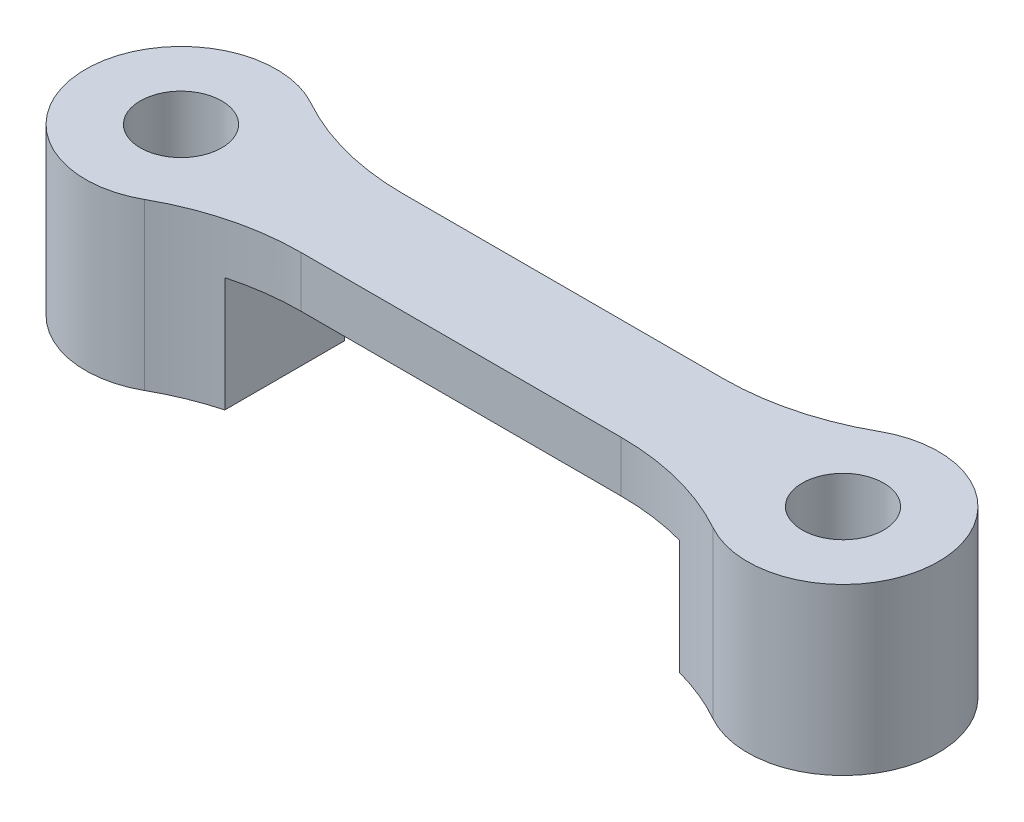
ISO-10303-21;
HEADER;
FILE_DESCRIPTION(('STEP AP214'),'2;1');
FILE_NAME('part.step','',(''),(''),'','','');
FILE_SCHEMA(('AUTOMOTIVE_DESIGN { 1 0 10303 214 1 1 1 1 }'));
ENDSEC;
DATA;
#1=APPLICATION_CONTEXT('core data for automotive mechanical design processes');
#2=APPLICATION_PROTOCOL_DEFINITION('international standard','automotive_design',2000,#1);
#3=PRODUCT_CONTEXT('',#1,'mechanical');
#4=PRODUCT('Part','Part','',(#3));
#5=PRODUCT_RELATED_PRODUCT_CATEGORY('part','',(#4));
#6=PRODUCT_DEFINITION_FORMATION('','',#4);
#7=PRODUCT_DEFINITION_CONTEXT('part definition',#1,'design');
#8=PRODUCT_DEFINITION('design','',#6,#7);
#9=PRODUCT_DEFINITION_SHAPE('','',#8);
#10=(LENGTH_UNIT() NAMED_UNIT(*) SI_UNIT(.MILLI.,.METRE.));
#11=(NAMED_UNIT(*) PLANE_ANGLE_UNIT() SI_UNIT($,.RADIAN.));
#12=(NAMED_UNIT(*) SI_UNIT($,.STERADIAN.) SOLID_ANGLE_UNIT());
#13=UNCERTAINTY_MEASURE_WITH_UNIT(LENGTH_MEASURE(1.E-05),#10,'distance_accuracy_value','');
#14=(GEOMETRIC_REPRESENTATION_CONTEXT(3) GLOBAL_UNCERTAINTY_ASSIGNED_CONTEXT((#13)) GLOBAL_UNIT_ASSIGNED_CONTEXT((#10,
#11,#12)) REPRESENTATION_CONTEXT('',''));
#15=CARTESIAN_POINT('',(0.,0.,0.));
#16=DIRECTION('',(0.,0.,1.));
#17=DIRECTION('',(1.,0.,0.));
#18=AXIS2_PLACEMENT_3D('',#15,#16,#17);
#19=CARTESIAN_POINT('',(0.,6.5,2.00000000000001));
#20=DIRECTION('',(0.,0.,-1.));
#21=DIRECTION('',(-1.,0.,0.));
#22=AXIS2_PLACEMENT_3D('',#19,#20,#21);
#23=PLANE('',#22);
#24=DIRECTION('',(-1.,0.,0.));
#25=VECTOR('',#24,1.);
#26=CARTESIAN_POINT('',(0.,4.5,2.00000000000001));
#27=LINE('',#26,#25);
#28=CARTESIAN_POINT('',(6.28713920895123,4.5,2.00000000000001));
#29=VERTEX_POINT('',#28);
#30=CARTESIAN_POINT('',(-6.28713920895123,4.5,2.00000000000001));
#31=VERTEX_POINT('',#30);
#32=EDGE_CURVE('E64',#29,#31,#27,.T.);
#33=ORIENTED_EDGE('',*,*,#32,.F.);
#34=DIRECTION('',(0.,1.,0.));
#35=VECTOR('',#34,1.);
#36=CARTESIAN_POINT('',(6.28713920895123,6.5,2.00000000000001));
#37=LINE('',#36,#35);
#38=CARTESIAN_POINT('',(6.28713920895123,6.5,2.00000000000001));
#39=VERTEX_POINT('',#38);
#40=EDGE_CURVE('E226',#29,#39,#37,.T.);
#41=ORIENTED_EDGE('',*,*,#40,.T.);
#42=DIRECTION('',(1.,0.,0.));
#43=VECTOR('',#42,1.);
#44=CARTESIAN_POINT('',(0.,6.5,2.00000000000001));
#45=LINE('',#44,#43);
#46=CARTESIAN_POINT('',(-6.28713920895123,6.5,2.00000000000001));
#47=VERTEX_POINT('',#46);
#48=EDGE_CURVE('E186',#47,#39,#45,.T.);
#49=ORIENTED_EDGE('',*,*,#48,.F.);
#50=DIRECTION('',(0.,1.,0.));
#51=VECTOR('',#50,1.);
#52=CARTESIAN_POINT('',(-6.28713920895123,0.,2.00000000000001));
#53=LINE('',#52,#51);
#54=EDGE_CURVE('E222',#47,#31,#53,.F.);
#55=ORIENTED_EDGE('',*,*,#54,.T.);
#56=EDGE_LOOP('',(#33,#41,#49,#55));
#57=FACE_BOUND('',#56,.T.);
#58=ADVANCED_FACE('F49',(#57),#23,.F.);
#59=CARTESIAN_POINT('',(0.,6.5,-2.));
#60=DIRECTION('',(0.,0.,-1.));
#61=DIRECTION('',(-1.,0.,0.));
#62=AXIS2_PLACEMENT_3D('',#59,#60,#61);
#63=PLANE('',#62);
#64=DIRECTION('',(0.,-1.,0.));
#65=VECTOR('',#64,1.);
#66=CARTESIAN_POINT('',(6.28713920895121,6.5,-2.));
#67=LINE('',#66,#65);
#68=CARTESIAN_POINT('',(6.28713920895121,6.5,-2.));
#69=VERTEX_POINT('',#68);
#70=CARTESIAN_POINT('',(6.28713920895121,4.5,-2.));
#71=VERTEX_POINT('',#70);
#72=EDGE_CURVE('E231',#69,#71,#67,.T.);
#73=ORIENTED_EDGE('',*,*,#72,.T.);
#74=DIRECTION('',(-1.,0.,0.));
#75=VECTOR('',#74,1.);
#76=CARTESIAN_POINT('',(0.,4.5,-2.));
#77=LINE('',#76,#75);
#78=CARTESIAN_POINT('',(-6.28713920895122,4.5,-1.99999999999999));
#79=VERTEX_POINT('',#78);
#80=EDGE_CURVE('E165',#71,#79,#77,.T.);
#81=ORIENTED_EDGE('',*,*,#80,.T.);
#82=DIRECTION('',(0.,-1.,0.));
#83=VECTOR('',#82,1.);
#84=CARTESIAN_POINT('',(-6.28713920895122,6.5,-2.));
#85=LINE('',#84,#83);
#86=CARTESIAN_POINT('',(-6.28713920895122,6.5,-2.));
#87=VERTEX_POINT('',#86);
#88=EDGE_CURVE('E163',#79,#87,#85,.F.);
#89=ORIENTED_EDGE('',*,*,#88,.T.);
#90=DIRECTION('',(1.,0.,0.));
#91=VECTOR('',#90,1.);
#92=CARTESIAN_POINT('',(0.,6.5,-2.));
#93=LINE('',#92,#91);
#94=EDGE_CURVE('E194',#87,#69,#93,.T.);
#95=ORIENTED_EDGE('',*,*,#94,.T.);
#96=EDGE_LOOP('',(#73,#81,#89,#95));
#97=FACE_BOUND('',#96,.T.);
#98=ADVANCED_FACE('F316',(#97),#63,.T.);
#99=CARTESIAN_POINT('',(0.,0.,0.));
#100=DIRECTION('',(0.,1.,0.));
#101=DIRECTION('',(0.,0.,1.));
#102=AXIS2_PLACEMENT_3D('',#99,#100,#101);
#103=PLANE('',#102);
#104=CARTESIAN_POINT('',(-13.,0.,0.));
#105=DIRECTION('',(0.,1.,0.));
#106=DIRECTION('',(0.,0.,1.));
#107=AXIS2_PLACEMENT_3D('',#104,#105,#106);
#108=CIRCLE('',#107,1.6);
#109=CARTESIAN_POINT('',(-13.,0.,-1.6));
#110=VERTEX_POINT('',#109);
#111=EDGE_CURVE('E177',#110,#110,#108,.T.);
#112=ORIENTED_EDGE('',*,*,#111,.T.);
#113=EDGE_LOOP('',(#112));
#114=FACE_BOUND('',#113,.T.);
#115=CARTESIAN_POINT('',(-6.28713920895122,0.,-12.));
#116=DIRECTION('',(0.,1.,0.));
#117=DIRECTION('',(0.,0.,1.));
#118=AXIS2_PLACEMENT_3D('',#115,#116,#117);
#119=CIRCLE('',#118,10.);
#120=CARTESIAN_POINT('',(-11.1692197842594,0.,-3.27272727272727));
#121=VERTEX_POINT('',#120);
#122=CARTESIAN_POINT('',(-8.925,0.,-2.35418793221393));
#123=VERTEX_POINT('',#122);
#124=EDGE_CURVE('E254',#121,#123,#119,.T.);
#125=ORIENTED_EDGE('',*,*,#124,.T.);
#126=DIRECTION('',(0.,0.,-1.));
#127=VECTOR('',#126,1.);
#128=CARTESIAN_POINT('',(-8.925,0.,-2.35418793221393));
#129=LINE('',#128,#127);
#130=CARTESIAN_POINT('',(-8.925,0.,2.35418793221393));
#131=VERTEX_POINT('',#130);
#132=EDGE_CURVE('E146',#131,#123,#129,.T.);
#133=ORIENTED_EDGE('',*,*,#132,.F.);
#134=CARTESIAN_POINT('',(-6.28713920895123,0.,12.));
#135=DIRECTION('',(0.,1.,0.));
#136=DIRECTION('',(0.,0.,1.));
#137=AXIS2_PLACEMENT_3D('',#134,#135,#136);
#138=CIRCLE('',#137,10.);
#139=CARTESIAN_POINT('',(-11.1692197842594,0.,3.27272727272728));
#140=VERTEX_POINT('',#139);
#141=EDGE_CURVE('E260',#131,#140,#138,.T.);
#142=ORIENTED_EDGE('',*,*,#141,.T.);
#143=CARTESIAN_POINT('',(-13.,0.,0.));
#144=DIRECTION('',(0.,1.,0.));
#145=DIRECTION('',(0.,0.,1.));
#146=AXIS2_PLACEMENT_3D('',#143,#144,#145);
#147=CIRCLE('',#146,3.75);
#148=EDGE_CURVE('E206',#121,#140,#147,.T.);
#149=ORIENTED_EDGE('',*,*,#148,.F.);
#150=EDGE_LOOP('',(#125,#133,#142,#149));
#151=FACE_BOUND('',#150,.T.);
#152=ADVANCED_FACE('F321',(#114,#151),#103,.F.);
#153=CARTESIAN_POINT('',(-13.,6.5,0.));
#154=DIRECTION('',(0.,-1.,0.));
#155=DIRECTION('',(0.,0.,-1.));
#156=AXIS2_PLACEMENT_3D('',#153,#154,#155);
#157=CYLINDRICAL_SURFACE('',#156,3.75);
#158=CARTESIAN_POINT('',(-13.,6.5,0.));
#159=DIRECTION('',(0.,1.,0.));
#160=DIRECTION('',(0.,0.,1.));
#161=AXIS2_PLACEMENT_3D('',#158,#159,#160);
#162=CIRCLE('',#161,3.75);
#163=CARTESIAN_POINT('',(-11.1692197842594,6.5,-3.27272727272727));
#164=VERTEX_POINT('',#163);
#165=CARTESIAN_POINT('',(-11.1692197842594,6.5,3.27272727272728));
#166=VERTEX_POINT('',#165);
#167=EDGE_CURVE('E182',#164,#166,#162,.T.);
#168=ORIENTED_EDGE('',*,*,#167,.F.);
#169=DIRECTION('',(0.,-1.,0.));
#170=VECTOR('',#169,1.);
#171=CARTESIAN_POINT('',(-11.1692197842594,6.5,-3.27272727272727));
#172=LINE('',#171,#170);
#173=EDGE_CURVE('E237',#164,#121,#172,.T.);
#174=ORIENTED_EDGE('',*,*,#173,.T.);
#175=ORIENTED_EDGE('',*,*,#148,.T.);
#176=DIRECTION('',(0.,-1.,0.));
#177=VECTOR('',#176,1.);
#178=CARTESIAN_POINT('',(-11.1692197842594,6.5,3.27272727272728));
#179=LINE('',#178,#177);
#180=EDGE_CURVE('E72',#140,#166,#179,.F.);
#181=ORIENTED_EDGE('',*,*,#180,.T.);
#182=EDGE_LOOP('',(#168,#174,#175,#181));
#183=FACE_BOUND('',#182,.T.);
#184=ADVANCED_FACE('F319',(#183),#157,.T.);
#185=CARTESIAN_POINT('',(13.,6.5,0.));
#186=DIRECTION('',(0.,-1.,0.));
#187=DIRECTION('',(0.,0.,-1.));
#188=AXIS2_PLACEMENT_3D('',#185,#186,#187);
#189=CYLINDRICAL_SURFACE('',#188,3.75);
#190=CARTESIAN_POINT('',(13.,6.5,0.));
#191=DIRECTION('',(0.,1.,0.));
#192=DIRECTION('',(0.,0.,1.));
#193=AXIS2_PLACEMENT_3D('',#190,#191,#192);
#194=CIRCLE('',#193,3.75);
#195=CARTESIAN_POINT('',(11.1692197842594,6.5,3.27272727272727));
#196=VERTEX_POINT('',#195);
#197=CARTESIAN_POINT('',(11.1692197842594,6.5,-3.27272727272728));
#198=VERTEX_POINT('',#197);
#199=EDGE_CURVE('E190',#196,#198,#194,.T.);
#200=ORIENTED_EDGE('',*,*,#199,.F.);
#201=DIRECTION('',(0.,-1.,0.));
#202=VECTOR('',#201,1.);
#203=CARTESIAN_POINT('',(11.1692197842594,6.5,3.27272727272727));
#204=LINE('',#203,#202);
#205=CARTESIAN_POINT('',(11.1692197842594,0.,3.27272727272727));
#206=VERTEX_POINT('',#205);
#207=EDGE_CURVE('E218',#196,#206,#204,.T.);
#208=ORIENTED_EDGE('',*,*,#207,.T.);
#209=CARTESIAN_POINT('',(13.,0.,0.));
#210=DIRECTION('',(0.,1.,0.));
#211=DIRECTION('',(0.,0.,1.));
#212=AXIS2_PLACEMENT_3D('',#209,#210,#211);
#213=CIRCLE('',#212,3.75);
#214=CARTESIAN_POINT('',(11.1692197842594,0.,-3.27272727272728));
#215=VERTEX_POINT('',#214);
#216=EDGE_CURVE('E209',#206,#215,#213,.T.);
#217=ORIENTED_EDGE('',*,*,#216,.T.);
#218=DIRECTION('',(0.,-1.,0.));
#219=VECTOR('',#218,1.);
#220=CARTESIAN_POINT('',(11.1692197842594,6.5,-3.27272727272728));
#221=LINE('',#220,#219);
#222=EDGE_CURVE('E202',#215,#198,#221,.F.);
#223=ORIENTED_EDGE('',*,*,#222,.T.);
#224=EDGE_LOOP('',(#200,#208,#217,#223));
#225=FACE_BOUND('',#224,.T.);
#226=ADVANCED_FACE('F307',(#225),#189,.T.);
#227=CARTESIAN_POINT('',(-13.,6.5,0.));
#228=DIRECTION('',(0.,-1.,0.));
#229=DIRECTION('',(0.,0.,-1.));
#230=AXIS2_PLACEMENT_3D('',#227,#228,#229);
#231=CYLINDRICAL_SURFACE('',#230,1.6);
#232=CARTESIAN_POINT('',(-13.,6.5,0.));
#233=DIRECTION('',(0.,1.,0.));
#234=DIRECTION('',(0.,0.,1.));
#235=AXIS2_PLACEMENT_3D('',#232,#233,#234);
#236=CIRCLE('',#235,1.6);
#237=CARTESIAN_POINT('',(-13.,6.5,-1.6));
#238=VERTEX_POINT('',#237);
#239=EDGE_CURVE('E178',#238,#238,#236,.T.);
#240=CARTESIAN_POINT('',(-13.,6.5,-1.6));
#241=CARTESIAN_POINT('',(-13.,6.43229166666667,-1.6));
#242=CARTESIAN_POINT('',(-13.,6.36458333333333,-1.6));
#243=CARTESIAN_POINT('',(-13.,6.22916666666667,-1.6));
#244=CARTESIAN_POINT('',(-13.,6.16145833333333,-1.6));
#245=CARTESIAN_POINT('',(-13.,6.02604166666667,-1.6));
#246=CARTESIAN_POINT('',(-13.,5.95833333333333,-1.6));
#247=CARTESIAN_POINT('',(-13.,5.82291666666667,-1.6));
#248=CARTESIAN_POINT('',(-13.,5.75520833333333,-1.6));
#249=CARTESIAN_POINT('',(-13.,5.61979166666667,-1.6));
#250=CARTESIAN_POINT('',(-13.,5.55208333333333,-1.6));
#251=CARTESIAN_POINT('',(-13.,5.41666666666667,-1.6));
#252=CARTESIAN_POINT('',(-13.,5.34895833333333,-1.6));
#253=CARTESIAN_POINT('',(-13.,5.21354166666667,-1.6));
#254=CARTESIAN_POINT('',(-13.,5.14583333333333,-1.6));
#255=CARTESIAN_POINT('',(-13.,5.01041666666667,-1.6));
#256=CARTESIAN_POINT('',(-13.,4.94270833333333,-1.6));
#257=CARTESIAN_POINT('',(-13.,4.80729166666667,-1.6));
#258=CARTESIAN_POINT('',(-13.,4.73958333333333,-1.6));
#259=CARTESIAN_POINT('',(-13.,4.60416666666667,-1.6));
#260=CARTESIAN_POINT('',(-13.,4.53645833333333,-1.6));
#261=CARTESIAN_POINT('',(-13.,4.40104166666667,-1.6));
#262=CARTESIAN_POINT('',(-13.,4.33333333333333,-1.6));
#263=CARTESIAN_POINT('',(-13.,4.19791666666667,-1.6));
#264=CARTESIAN_POINT('',(-13.,4.13020833333333,-1.6));
#265=CARTESIAN_POINT('',(-13.,3.99479166666667,-1.6));
#266=CARTESIAN_POINT('',(-13.,3.92708333333333,-1.6));
#267=CARTESIAN_POINT('',(-13.,3.79166666666667,-1.6));
#268=CARTESIAN_POINT('',(-13.,3.72395833333333,-1.6));
#269=CARTESIAN_POINT('',(-13.,3.58854166666667,-1.6));
#270=CARTESIAN_POINT('',(-13.,3.52083333333333,-1.6));
#271=CARTESIAN_POINT('',(-13.,3.38541666666667,-1.6));
#272=CARTESIAN_POINT('',(-13.,3.31770833333333,-1.6));
#273=CARTESIAN_POINT('',(-13.,3.18229166666667,-1.6));
#274=CARTESIAN_POINT('',(-13.,3.11458333333333,-1.6));
#275=CARTESIAN_POINT('',(-13.,2.97916666666667,-1.6));
#276=CARTESIAN_POINT('',(-13.,2.91145833333333,-1.6));
#277=CARTESIAN_POINT('',(-13.,2.77604166666667,-1.6));
#278=CARTESIAN_POINT('',(-13.,2.70833333333333,-1.6));
#279=CARTESIAN_POINT('',(-13.,2.57291666666667,-1.6));
#280=CARTESIAN_POINT('',(-13.,2.50520833333333,-1.6));
#281=CARTESIAN_POINT('',(-13.,2.36979166666667,-1.6));
#282=CARTESIAN_POINT('',(-13.,2.30208333333333,-1.6));
#283=CARTESIAN_POINT('',(-13.,2.16666666666667,-1.6));
#284=CARTESIAN_POINT('',(-13.,2.09895833333333,-1.6));
#285=CARTESIAN_POINT('',(-13.,1.96354166666667,-1.6));
#286=CARTESIAN_POINT('',(-13.,1.89583333333333,-1.6));
#287=CARTESIAN_POINT('',(-13.,1.76041666666667,-1.6));
#288=CARTESIAN_POINT('',(-13.,1.69270833333333,-1.6));
#289=CARTESIAN_POINT('',(-13.,1.55729166666667,-1.6));
#290=CARTESIAN_POINT('',(-13.,1.48958333333333,-1.6));
#291=CARTESIAN_POINT('',(-13.,1.35416666666667,-1.6));
#292=CARTESIAN_POINT('',(-13.,1.28645833333333,-1.6));
#293=CARTESIAN_POINT('',(-13.,1.15104166666667,-1.6));
#294=CARTESIAN_POINT('',(-13.,1.08333333333333,-1.6));
#295=CARTESIAN_POINT('',(-13.,0.947916666666667,-1.6));
#296=CARTESIAN_POINT('',(-13.,0.880208333333333,-1.6));
#297=CARTESIAN_POINT('',(-13.,0.744791666666667,-1.6));
#298=CARTESIAN_POINT('',(-13.,0.677083333333333,-1.6));
#299=CARTESIAN_POINT('',(-13.,0.541666666666667,-1.6));
#300=CARTESIAN_POINT('',(-13.,0.473958333333333,-1.6));
#301=CARTESIAN_POINT('',(-13.,0.338541666666667,-1.6));
#302=CARTESIAN_POINT('',(-13.,0.270833333333334,-1.6));
#303=CARTESIAN_POINT('',(-13.,0.135416666666667,-1.6));
#304=CARTESIAN_POINT('',(-13.,0.0677083333333334,-1.6));
#305=CARTESIAN_POINT('',(-13.,0.,-1.6));
#306=B_SPLINE_CURVE_WITH_KNOTS('',3,(#240,#241,#242,#243,#244,#245,#246,#247,#248,#249,#250,
#251,#252,#253,#254,#255,#256,#257,#258,#259,#260,#261,#262,#263,#264,#265,#266,#267,#268,#269,
#270,#271,#272,#273,#274,#275,#276,#277,#278,#279,#280,#281,#282,#283,#284,#285,#286,#287,#288,
#289,#290,#291,#292,#293,#294,#295,#296,#297,#298,#299,#300,#301,#302,#303,#304,#305),
.UNSPECIFIED.,.F.,.F.,(4,2,2,2,2,2,2,2,2,2,2,2,2,2,2,2,2,2,2,2,2,2,2,2,2,2,2,2,2,2,2,2,4),(0.,
0.203125,0.40625,0.609375000000001,0.812500000000001,1.015625,1.21875,1.421875,1.625,1.828125,
2.03125,2.234375,2.4375,2.640625,2.84375,3.046875,3.25,3.453125,3.65625,3.859375,4.0625,
4.265625,4.46875,4.671875,4.875,5.078125,5.28125,5.484375,5.6875,5.890625,6.09375,6.296875,6.5),.UNSPECIFIED.);
#307=EDGE_CURVE('BSEAM341',#238,#110,#306,.T.);
#308=ORIENTED_EDGE('',*,*,#239,.T.);
#309=ORIENTED_EDGE('',*,*,#111,.F.);
#310=ORIENTED_EDGE('',*,*,#307,.T.);
#311=ORIENTED_EDGE('',*,*,#307,.F.);
#312=EDGE_LOOP('',(#308,#310,#309,#311));
#313=FACE_BOUND('',#312,.T.);
#314=ADVANCED_FACE('F341',(#313),#231,.F.);
#315=CARTESIAN_POINT('',(13.,6.5,0.));
#316=DIRECTION('',(0.,-1.,0.));
#317=DIRECTION('',(0.,0.,-1.));
#318=AXIS2_PLACEMENT_3D('',#315,#316,#317);
#319=CYLINDRICAL_SURFACE('',#318,1.6);
#320=CARTESIAN_POINT('',(13.,6.5,0.));
#321=DIRECTION('',(0.,1.,0.));
#322=DIRECTION('',(0.,0.,1.));
#323=AXIS2_PLACEMENT_3D('',#320,#321,#322);
#324=CIRCLE('',#323,1.6);
#325=CARTESIAN_POINT('',(13.,6.5,-1.60000000000001));
#326=VERTEX_POINT('',#325);
#327=EDGE_CURVE('E198',#326,#326,#324,.T.);
#328=CARTESIAN_POINT('',(13.,0.,0.));
#329=DIRECTION('',(0.,1.,0.));
#330=DIRECTION('',(0.,0.,1.));
#331=AXIS2_PLACEMENT_3D('',#328,#329,#330);
#332=CIRCLE('',#331,1.6);
#333=CARTESIAN_POINT('',(13.,0.,-1.60000000000001));
#334=VERTEX_POINT('',#333);
#335=EDGE_CURVE('E183',#334,#334,#332,.T.);
#336=CARTESIAN_POINT('',(13.,6.5,-1.60000000000001));
#337=CARTESIAN_POINT('',(13.,6.43229166666667,-1.60000000000001));
#338=CARTESIAN_POINT('',(13.,6.36458333333333,-1.60000000000001));
#339=CARTESIAN_POINT('',(13.,6.22916666666667,-1.60000000000001));
#340=CARTESIAN_POINT('',(13.,6.16145833333333,-1.60000000000001));
#341=CARTESIAN_POINT('',(13.,6.02604166666667,-1.60000000000001));
#342=CARTESIAN_POINT('',(13.,5.95833333333333,-1.60000000000001));
#343=CARTESIAN_POINT('',(13.,5.82291666666667,-1.60000000000001));
#344=CARTESIAN_POINT('',(13.,5.75520833333333,-1.60000000000001));
#345=CARTESIAN_POINT('',(13.,5.61979166666667,-1.60000000000001));
#346=CARTESIAN_POINT('',(13.,5.55208333333333,-1.60000000000001));
#347=CARTESIAN_POINT('',(13.,5.41666666666667,-1.60000000000001));
#348=CARTESIAN_POINT('',(13.,5.34895833333333,-1.60000000000001));
#349=CARTESIAN_POINT('',(13.,5.21354166666667,-1.60000000000001));
#350=CARTESIAN_POINT('',(13.,5.14583333333333,-1.60000000000001));
#351=CARTESIAN_POINT('',(13.,5.01041666666667,-1.60000000000001));
#352=CARTESIAN_POINT('',(13.,4.94270833333333,-1.60000000000001));
#353=CARTESIAN_POINT('',(13.,4.80729166666667,-1.60000000000001));
#354=CARTESIAN_POINT('',(13.,4.73958333333333,-1.60000000000001));
#355=CARTESIAN_POINT('',(13.,4.60416666666667,-1.60000000000001));
#356=CARTESIAN_POINT('',(13.,4.53645833333333,-1.60000000000001));
#357=CARTESIAN_POINT('',(13.,4.40104166666667,-1.60000000000001));
#358=CARTESIAN_POINT('',(13.,4.33333333333333,-1.60000000000001));
#359=CARTESIAN_POINT('',(13.,4.19791666666667,-1.60000000000001));
#360=CARTESIAN_POINT('',(13.,4.13020833333333,-1.60000000000001));
#361=CARTESIAN_POINT('',(13.,3.99479166666667,-1.60000000000001));
#362=CARTESIAN_POINT('',(13.,3.92708333333333,-1.60000000000001));
#363=CARTESIAN_POINT('',(13.,3.79166666666667,-1.60000000000001));
#364=CARTESIAN_POINT('',(13.,3.72395833333333,-1.60000000000001));
#365=CARTESIAN_POINT('',(13.,3.58854166666667,-1.60000000000001));
#366=CARTESIAN_POINT('',(13.,3.52083333333333,-1.60000000000001));
#367=CARTESIAN_POINT('',(13.,3.38541666666667,-1.60000000000001));
#368=CARTESIAN_POINT('',(13.,3.31770833333333,-1.60000000000001));
#369=CARTESIAN_POINT('',(13.,3.18229166666667,-1.60000000000001));
#370=CARTESIAN_POINT('',(13.,3.11458333333333,-1.60000000000001));
#371=CARTESIAN_POINT('',(13.,2.97916666666667,-1.60000000000001));
#372=CARTESIAN_POINT('',(13.,2.91145833333333,-1.60000000000001));
#373=CARTESIAN_POINT('',(13.,2.77604166666667,-1.60000000000001));
#374=CARTESIAN_POINT('',(13.,2.70833333333333,-1.60000000000001));
#375=CARTESIAN_POINT('',(13.,2.57291666666667,-1.60000000000001));
#376=CARTESIAN_POINT('',(13.,2.50520833333333,-1.60000000000001));
#377=CARTESIAN_POINT('',(13.,2.36979166666667,-1.60000000000001));
#378=CARTESIAN_POINT('',(13.,2.30208333333333,-1.60000000000001));
#379=CARTESIAN_POINT('',(13.,2.16666666666667,-1.60000000000001));
#380=CARTESIAN_POINT('',(13.,2.09895833333333,-1.60000000000001));
#381=CARTESIAN_POINT('',(13.,1.96354166666667,-1.60000000000001));
#382=CARTESIAN_POINT('',(13.,1.89583333333333,-1.60000000000001));
#383=CARTESIAN_POINT('',(13.,1.76041666666667,-1.60000000000001));
#384=CARTESIAN_POINT('',(13.,1.69270833333333,-1.60000000000001));
#385=CARTESIAN_POINT('',(13.,1.55729166666667,-1.60000000000001));
#386=CARTESIAN_POINT('',(13.,1.48958333333333,-1.60000000000001));
#387=CARTESIAN_POINT('',(13.,1.35416666666667,-1.60000000000001));
#388=CARTESIAN_POINT('',(13.,1.28645833333333,-1.60000000000001));
#389=CARTESIAN_POINT('',(13.,1.15104166666667,-1.60000000000001));
#390=CARTESIAN_POINT('',(13.,1.08333333333333,-1.60000000000001));
#391=CARTESIAN_POINT('',(13.,0.947916666666667,-1.60000000000001));
#392=CARTESIAN_POINT('',(13.,0.880208333333333,-1.60000000000001));
#393=CARTESIAN_POINT('',(13.,0.744791666666667,-1.60000000000001));
#394=CARTESIAN_POINT('',(13.,0.677083333333333,-1.60000000000001));
#395=CARTESIAN_POINT('',(13.,0.541666666666667,-1.60000000000001));
#396=CARTESIAN_POINT('',(13.,0.473958333333333,-1.60000000000001));
#397=CARTESIAN_POINT('',(13.,0.338541666666667,-1.60000000000001));
#398=CARTESIAN_POINT('',(13.,0.270833333333334,-1.60000000000001));
#399=CARTESIAN_POINT('',(13.,0.135416666666667,-1.60000000000001));
#400=CARTESIAN_POINT('',(13.,0.0677083333333334,-1.60000000000001));
#401=CARTESIAN_POINT('',(13.,0.,-1.60000000000001));
#402=B_SPLINE_CURVE_WITH_KNOTS('',3,(#336,#337,#338,#339,#340,#341,#342,#343,#344,#345,#346,
#347,#348,#349,#350,#351,#352,#353,#354,#355,#356,#357,#358,#359,#360,#361,#362,#363,#364,#365,
#366,#367,#368,#369,#370,#371,#372,#373,#374,#375,#376,#377,#378,#379,#380,#381,#382,#383,#384,
#385,#386,#387,#388,#389,#390,#391,#392,#393,#394,#395,#396,#397,#398,#399,#400,#401),
.UNSPECIFIED.,.F.,.F.,(4,2,2,2,2,2,2,2,2,2,2,2,2,2,2,2,2,2,2,2,2,2,2,2,2,2,2,2,2,2,2,2,4),(0.,
0.203125,0.40625,0.609375000000001,0.812500000000001,1.015625,1.21875,1.421875,1.625,1.828125,
2.03125,2.234375,2.4375,2.640625,2.84375,3.046875,3.25,3.453125,3.65625,3.859375,4.0625,
4.265625,4.46875,4.671875,4.875,5.078125,5.28125,5.484375,5.6875,5.890625,6.09375,6.296875,6.5),.UNSPECIFIED.);
#403=EDGE_CURVE('BSEAM344',#326,#334,#402,.T.);
#404=ORIENTED_EDGE('',*,*,#327,.T.);
#405=ORIENTED_EDGE('',*,*,#335,.F.);
#406=ORIENTED_EDGE('',*,*,#403,.T.);
#407=ORIENTED_EDGE('',*,*,#403,.F.);
#408=EDGE_LOOP('',(#404,#406,#405,#407));
#409=FACE_BOUND('',#408,.T.);
#410=ADVANCED_FACE('F344',(#409),#319,.F.);
#411=CARTESIAN_POINT('',(0.,6.5,0.));
#412=DIRECTION('',(0.,1.,0.));
#413=DIRECTION('',(0.,0.,1.));
#414=AXIS2_PLACEMENT_3D('',#411,#412,#413);
#415=PLANE('',#414);
#416=ORIENTED_EDGE('',*,*,#239,.F.);
#417=EDGE_LOOP('',(#416));
#418=FACE_BOUND('',#417,.T.);
#419=ORIENTED_EDGE('',*,*,#94,.F.);
#420=CARTESIAN_POINT('',(-6.28713920895122,6.5,-12.));
#421=DIRECTION('',(0.,1.,0.));
#422=DIRECTION('',(0.,0.,1.));
#423=AXIS2_PLACEMENT_3D('',#420,#421,#422);
#424=CIRCLE('',#423,10.);
#425=EDGE_CURVE('E257',#87,#164,#424,.F.);
#426=ORIENTED_EDGE('',*,*,#425,.T.);
#427=ORIENTED_EDGE('',*,*,#167,.T.);
#428=CARTESIAN_POINT('',(-6.28713920895123,6.5,12.));
#429=DIRECTION('',(0.,1.,0.));
#430=DIRECTION('',(0.,0.,1.));
#431=AXIS2_PLACEMENT_3D('',#428,#429,#430);
#432=CIRCLE('',#431,10.);
#433=EDGE_CURVE('E58',#166,#47,#432,.F.);
#434=ORIENTED_EDGE('',*,*,#433,.T.);
#435=ORIENTED_EDGE('',*,*,#48,.T.);
#436=CARTESIAN_POINT('',(6.28713920895123,6.5,12.));
#437=DIRECTION('',(0.,1.,0.));
#438=DIRECTION('',(0.,0.,1.));
#439=AXIS2_PLACEMENT_3D('',#436,#437,#438);
#440=CIRCLE('',#439,10.);
#441=EDGE_CURVE('E245',#39,#196,#440,.F.);
#442=ORIENTED_EDGE('',*,*,#441,.T.);
#443=ORIENTED_EDGE('',*,*,#199,.T.);
#444=CARTESIAN_POINT('',(6.28713920895121,6.5,-12.));
#445=DIRECTION('',(0.,1.,0.));
#446=DIRECTION('',(0.,0.,1.));
#447=AXIS2_PLACEMENT_3D('',#444,#445,#446);
#448=CIRCLE('',#447,10.);
#449=EDGE_CURVE('E251',#198,#69,#448,.F.);
#450=ORIENTED_EDGE('',*,*,#449,.T.);
#451=EDGE_LOOP('',(#419,#426,#427,#434,#435,#442,#443,#450));
#452=FACE_BOUND('',#451,.T.);
#453=ORIENTED_EDGE('',*,*,#327,.F.);
#454=EDGE_LOOP('',(#453));
#455=FACE_BOUND('',#454,.T.);
#456=ADVANCED_FACE('F267',(#418,#452,#455),#415,.T.);
#457=CARTESIAN_POINT('',(6.28713920895123,0.,12.));
#458=DIRECTION('',(0.,1.,0.));
#459=DIRECTION('',(0.,0.,1.));
#460=AXIS2_PLACEMENT_3D('',#457,#458,#459);
#461=CIRCLE('',#460,10.);
#462=CARTESIAN_POINT('',(8.925,0.,2.35418793221393));
#463=VERTEX_POINT('',#462);
#464=EDGE_CURVE('E241',#206,#463,#461,.T.);
#465=ORIENTED_EDGE('',*,*,#464,.T.);
#466=DIRECTION('',(0.,0.,1.));
#467=VECTOR('',#466,1.);
#468=CARTESIAN_POINT('',(8.925,0.,-2.35418793221393));
#469=LINE('',#468,#467);
#470=CARTESIAN_POINT('',(8.925,0.,-2.35418793221393));
#471=VERTEX_POINT('',#470);
#472=EDGE_CURVE('E158',#471,#463,#469,.T.);
#473=ORIENTED_EDGE('',*,*,#472,.F.);
#474=CARTESIAN_POINT('',(6.28713920895121,0.,-12.));
#475=DIRECTION('',(0.,1.,0.));
#476=DIRECTION('',(0.,0.,1.));
#477=AXIS2_PLACEMENT_3D('',#474,#475,#476);
#478=CIRCLE('',#477,10.);
#479=EDGE_CURVE('E248',#471,#215,#478,.T.);
#480=ORIENTED_EDGE('',*,*,#479,.T.);
#481=ORIENTED_EDGE('',*,*,#216,.F.);
#482=EDGE_LOOP('',(#465,#473,#480,#481));
#483=FACE_BOUND('',#482,.T.);
#484=ORIENTED_EDGE('',*,*,#335,.T.);
#485=EDGE_LOOP('',(#484));
#486=FACE_BOUND('',#485,.T.);
#487=ADVANCED_FACE('F297',(#483,#486),#103,.F.);
#488=CARTESIAN_POINT('',(6.28713920895123,6.5,12.));
#489=DIRECTION('',(0.,-1.,0.));
#490=DIRECTION('',(0.,0.,-1.));
#491=AXIS2_PLACEMENT_3D('',#488,#489,#490);
#492=CYLINDRICAL_SURFACE('',#491,10.);
#493=CARTESIAN_POINT('',(6.28713920895123,4.5,12.));
#494=DIRECTION('',(0.,-1.,0.));
#495=DIRECTION('',(0.,0.,-1.));
#496=AXIS2_PLACEMENT_3D('',#493,#494,#495);
#497=CIRCLE('',#496,10.);
#498=CARTESIAN_POINT('',(8.925,4.5,2.35418793221393));
#499=VERTEX_POINT('',#498);
#500=EDGE_CURVE('E166',#499,#29,#497,.F.);
#501=ORIENTED_EDGE('',*,*,#500,.F.);
#502=DIRECTION('',(0.,-1.,0.));
#503=VECTOR('',#502,1.);
#504=CARTESIAN_POINT('',(8.925,4.5,2.35418793221393));
#505=LINE('',#504,#503);
#506=EDGE_CURVE('E277',#499,#463,#505,.T.);
#507=ORIENTED_EDGE('',*,*,#506,.T.);
#508=ORIENTED_EDGE('',*,*,#464,.F.);
#509=ORIENTED_EDGE('',*,*,#207,.F.);
#510=ORIENTED_EDGE('',*,*,#441,.F.);
#511=ORIENTED_EDGE('',*,*,#40,.F.);
#512=EDGE_LOOP('',(#501,#507,#508,#509,#510,#511));
#513=FACE_BOUND('',#512,.T.);
#514=ADVANCED_FACE('F311',(#513),#492,.F.);
#515=CARTESIAN_POINT('',(6.28713920895121,6.5,-12.));
#516=DIRECTION('',(0.,-1.,0.));
#517=DIRECTION('',(0.,0.,-1.));
#518=AXIS2_PLACEMENT_3D('',#515,#516,#517);
#519=CYLINDRICAL_SURFACE('',#518,10.);
#520=ORIENTED_EDGE('',*,*,#479,.F.);
#521=DIRECTION('',(0.,-1.,0.));
#522=VECTOR('',#521,1.);
#523=CARTESIAN_POINT('',(8.925,4.5,-2.35418793221393));
#524=LINE('',#523,#522);
#525=CARTESIAN_POINT('',(8.925,4.5,-2.35418793221393));
#526=VERTEX_POINT('',#525);
#527=EDGE_CURVE('E151',#526,#471,#524,.T.);
#528=ORIENTED_EDGE('',*,*,#527,.F.);
#529=CARTESIAN_POINT('',(6.28713920895121,4.5,-12.));
#530=DIRECTION('',(0.,-1.,0.));
#531=DIRECTION('',(0.,0.,-1.));
#532=AXIS2_PLACEMENT_3D('',#529,#530,#531);
#533=CIRCLE('',#532,10.);
#534=EDGE_CURVE('E170',#71,#526,#533,.F.);
#535=ORIENTED_EDGE('',*,*,#534,.F.);
#536=ORIENTED_EDGE('',*,*,#72,.F.);
#537=ORIENTED_EDGE('',*,*,#449,.F.);
#538=ORIENTED_EDGE('',*,*,#222,.F.);
#539=EDGE_LOOP('',(#520,#528,#535,#536,#537,#538));
#540=FACE_BOUND('',#539,.T.);
#541=ADVANCED_FACE('F302',(#540),#519,.F.);
#542=CARTESIAN_POINT('',(-6.28713920895122,6.5,-12.));
#543=DIRECTION('',(0.,-1.,0.));
#544=DIRECTION('',(0.,0.,-1.));
#545=AXIS2_PLACEMENT_3D('',#542,#543,#544);
#546=CYLINDRICAL_SURFACE('',#545,10.);
#547=CARTESIAN_POINT('',(-6.28713920895122,4.5,-12.));
#548=DIRECTION('',(0.,-1.,0.));
#549=DIRECTION('',(0.,0.,-1.));
#550=AXIS2_PLACEMENT_3D('',#547,#548,#549);
#551=CIRCLE('',#550,10.);
#552=CARTESIAN_POINT('',(-8.925,4.5,-2.35418793221393));
#553=VERTEX_POINT('',#552);
#554=EDGE_CURVE('E155',#553,#79,#551,.F.);
#555=ORIENTED_EDGE('',*,*,#554,.F.);
#556=DIRECTION('',(0.,-1.,0.));
#557=VECTOR('',#556,1.);
#558=CARTESIAN_POINT('',(-8.925,4.5,-2.35418793221393));
#559=LINE('',#558,#557);
#560=EDGE_CURVE('E140',#553,#123,#559,.T.);
#561=ORIENTED_EDGE('',*,*,#560,.T.);
#562=ORIENTED_EDGE('',*,*,#124,.F.);
#563=ORIENTED_EDGE('',*,*,#173,.F.);
#564=ORIENTED_EDGE('',*,*,#425,.F.);
#565=ORIENTED_EDGE('',*,*,#88,.F.);
#566=EDGE_LOOP('',(#555,#561,#562,#563,#564,#565));
#567=FACE_BOUND('',#566,.T.);
#568=ADVANCED_FACE('F161',(#567),#546,.F.);
#569=CARTESIAN_POINT('',(-6.28713920895123,6.5,12.));
#570=DIRECTION('',(0.,-1.,0.));
#571=DIRECTION('',(0.,0.,-1.));
#572=AXIS2_PLACEMENT_3D('',#569,#570,#571);
#573=CYLINDRICAL_SURFACE('',#572,10.);
#574=ORIENTED_EDGE('',*,*,#141,.F.);
#575=DIRECTION('',(0.,-1.,0.));
#576=VECTOR('',#575,1.);
#577=CARTESIAN_POINT('',(-8.925,4.5,2.35418793221393));
#578=LINE('',#577,#576);
#579=CARTESIAN_POINT('',(-8.925,4.5,2.35418793221393));
#580=VERTEX_POINT('',#579);
#581=EDGE_CURVE('E275',#580,#131,#578,.T.);
#582=ORIENTED_EDGE('',*,*,#581,.F.);
#583=CARTESIAN_POINT('',(-6.28713920895123,4.5,12.));
#584=DIRECTION('',(0.,-1.,0.));
#585=DIRECTION('',(0.,0.,-1.));
#586=AXIS2_PLACEMENT_3D('',#583,#584,#585);
#587=CIRCLE('',#586,10.);
#588=EDGE_CURVE('E11',#31,#580,#587,.F.);
#589=ORIENTED_EDGE('',*,*,#588,.F.);
#590=ORIENTED_EDGE('',*,*,#54,.F.);
#591=ORIENTED_EDGE('',*,*,#433,.F.);
#592=ORIENTED_EDGE('',*,*,#180,.F.);
#593=EDGE_LOOP('',(#574,#582,#589,#590,#591,#592));
#594=FACE_BOUND('',#593,.T.);
#595=ADVANCED_FACE('F51',(#594),#573,.F.);
#596=CARTESIAN_POINT('',(0.,4.5,0.));
#597=DIRECTION('',(0.,-1.,0.));
#598=DIRECTION('',(0.,0.,-1.));
#599=AXIS2_PLACEMENT_3D('',#596,#597,#598);
#600=PLANE('',#599);
#601=ORIENTED_EDGE('',*,*,#534,.T.);
#602=DIRECTION('',(0.,0.,1.));
#603=VECTOR('',#602,1.);
#604=CARTESIAN_POINT('',(8.925,4.5,-2.35418793221393));
#605=LINE('',#604,#603);
#606=EDGE_CURVE('E152',#526,#499,#605,.T.);
#607=ORIENTED_EDGE('',*,*,#606,.T.);
#608=ORIENTED_EDGE('',*,*,#500,.T.);
#609=ORIENTED_EDGE('',*,*,#32,.T.);
#610=ORIENTED_EDGE('',*,*,#588,.T.);
#611=DIRECTION('',(0.,0.,-1.));
#612=VECTOR('',#611,1.);
#613=CARTESIAN_POINT('',(-8.925,4.5,-2.35418793221393));
#614=LINE('',#613,#612);
#615=EDGE_CURVE('E143',#580,#553,#614,.T.);
#616=ORIENTED_EDGE('',*,*,#615,.T.);
#617=ORIENTED_EDGE('',*,*,#554,.T.);
#618=ORIENTED_EDGE('',*,*,#80,.F.);
#619=EDGE_LOOP('',(#601,#607,#608,#609,#610,#616,#617,#618));
#620=FACE_BOUND('',#619,.T.);
#621=ADVANCED_FACE('F154',(#620),#600,.T.);
#622=CARTESIAN_POINT('',(-8.925,4.5,-2.35418793221393));
#623=DIRECTION('',(-1.,0.,0.));
#624=DIRECTION('',(0.,0.,1.));
#625=AXIS2_PLACEMENT_3D('',#622,#623,#624);
#626=PLANE('',#625);
#627=ORIENTED_EDGE('',*,*,#132,.T.);
#628=ORIENTED_EDGE('',*,*,#560,.F.);
#629=ORIENTED_EDGE('',*,*,#615,.F.);
#630=ORIENTED_EDGE('',*,*,#581,.T.);
#631=EDGE_LOOP('',(#627,#628,#629,#630));
#632=FACE_BOUND('',#631,.T.);
#633=ADVANCED_FACE('F142',(#632),#626,.F.);
#634=CARTESIAN_POINT('',(8.925,4.5,-2.35418793221393));
#635=DIRECTION('',(1.,0.,0.));
#636=DIRECTION('',(0.,0.,-1.));
#637=AXIS2_PLACEMENT_3D('',#634,#635,#636);
#638=PLANE('',#637);
#639=ORIENTED_EDGE('',*,*,#472,.T.);
#640=ORIENTED_EDGE('',*,*,#506,.F.);
#641=ORIENTED_EDGE('',*,*,#606,.F.);
#642=ORIENTED_EDGE('',*,*,#527,.T.);
#643=EDGE_LOOP('',(#639,#640,#641,#642));
#644=FACE_BOUND('',#643,.T.);
#645=ADVANCED_FACE('F291',(#644),#638,.F.);
#646=CLOSED_SHELL('',(#58,#98,#152,#184,#226,#314,#410,#456,#487,#514,#541,#568,#595,#621,#633,#645));
#647=MANIFOLD_SOLID_BREP('B2',#646);
#648=ADVANCED_BREP_SHAPE_REPRESENTATION('',(#18,#647),#14);
#649=SHAPE_DEFINITION_REPRESENTATION(#9,#648);
ENDSEC;
END-ISO-10303-21;
